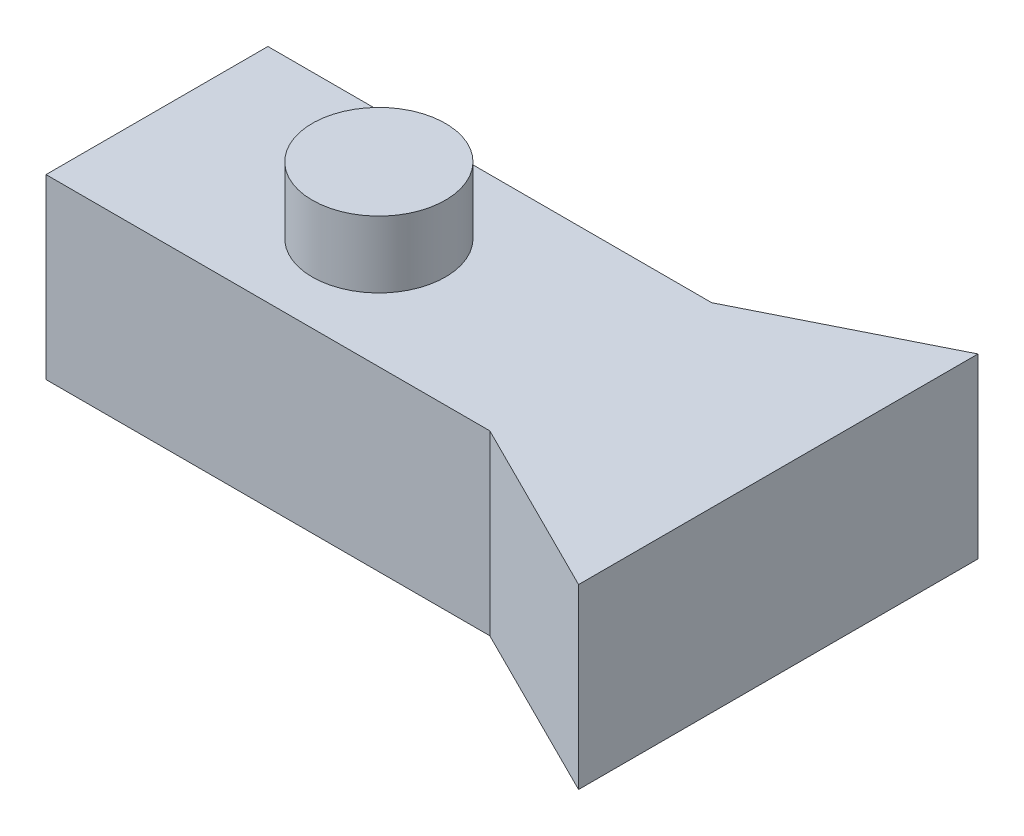
ISO-10303-21;
HEADER;
FILE_DESCRIPTION(('STEP AP214'),'2;1');
FILE_NAME('part.step','',(''),(''),'','','');
FILE_SCHEMA(('AUTOMOTIVE_DESIGN { 1 0 10303 214 1 1 1 1 }'));
ENDSEC;
DATA;
#1=APPLICATION_CONTEXT('core data for automotive mechanical design processes');
#2=APPLICATION_PROTOCOL_DEFINITION('international standard','automotive_design',2000,#1);
#3=PRODUCT_CONTEXT('',#1,'mechanical');
#4=PRODUCT('Part','Part','',(#3));
#5=PRODUCT_RELATED_PRODUCT_CATEGORY('part','',(#4));
#6=PRODUCT_DEFINITION_FORMATION('','',#4);
#7=PRODUCT_DEFINITION_CONTEXT('part definition',#1,'design');
#8=PRODUCT_DEFINITION('design','',#6,#7);
#9=PRODUCT_DEFINITION_SHAPE('','',#8);
#10=(LENGTH_UNIT() NAMED_UNIT(*) SI_UNIT(.MILLI.,.METRE.));
#11=(NAMED_UNIT(*) PLANE_ANGLE_UNIT() SI_UNIT($,.RADIAN.));
#12=(NAMED_UNIT(*) SI_UNIT($,.STERADIAN.) SOLID_ANGLE_UNIT());
#13=UNCERTAINTY_MEASURE_WITH_UNIT(LENGTH_MEASURE(1.E-05),#10,'distance_accuracy_value','');
#14=(GEOMETRIC_REPRESENTATION_CONTEXT(3) GLOBAL_UNCERTAINTY_ASSIGNED_CONTEXT((#13)) GLOBAL_UNIT_ASSIGNED_CONTEXT((#10,
#11,#12)) REPRESENTATION_CONTEXT('',''));
#15=CARTESIAN_POINT('',(0.,0.,0.));
#16=DIRECTION('',(0.,0.,1.));
#17=DIRECTION('',(1.,0.,0.));
#18=AXIS2_PLACEMENT_3D('',#15,#16,#17);
#19=CARTESIAN_POINT('',(200.,400.,-400.));
#20=DIRECTION('',(-0.447213595499958,0.,0.894427190999916));
#21=DIRECTION('',(0.894427190999916,0.,0.447213595499958));
#22=AXIS2_PLACEMENT_3D('',#19,#20,#21);
#23=PLANE('',#22);
#24=DIRECTION('',(-0.894427190999916,0.,-0.447213595499958));
#25=VECTOR('',#24,1.);
#26=CARTESIAN_POINT('',(200.,0.,-400.));
#27=LINE('',#26,#25);
#28=CARTESIAN_POINT('',(1400.,0.,200.));
#29=VERTEX_POINT('',#28);
#30=CARTESIAN_POINT('',(1000.,0.,0.));
#31=VERTEX_POINT('',#30);
#32=EDGE_CURVE('E116',#29,#31,#27,.T.);
#33=ORIENTED_EDGE('',*,*,#32,.F.);
#34=DIRECTION('',(0.,-1.,0.));
#35=VECTOR('',#34,1.);
#36=CARTESIAN_POINT('',(1400.,400.,200.));
#37=LINE('',#36,#35);
#38=CARTESIAN_POINT('',(1400.,400.,200.));
#39=VERTEX_POINT('',#38);
#40=EDGE_CURVE('E11',#39,#29,#37,.T.);
#41=ORIENTED_EDGE('',*,*,#40,.F.);
#42=DIRECTION('',(-0.894427190999916,0.,-0.447213595499958));
#43=VECTOR('',#42,1.);
#44=CARTESIAN_POINT('',(200.,400.,-400.));
#45=LINE('',#44,#43);
#46=CARTESIAN_POINT('',(1000.,400.,0.));
#47=VERTEX_POINT('',#46);
#48=EDGE_CURVE('E131',#39,#47,#45,.T.);
#49=ORIENTED_EDGE('',*,*,#48,.T.);
#50=DIRECTION('',(0.,-1.,0.));
#51=VECTOR('',#50,1.);
#52=CARTESIAN_POINT('',(1000.,400.,0.));
#53=LINE('',#52,#51);
#54=EDGE_CURVE('E79',#47,#31,#53,.T.);
#55=ORIENTED_EDGE('',*,*,#54,.T.);
#56=EDGE_LOOP('',(#33,#41,#49,#55));
#57=FACE_BOUND('',#56,.T.);
#58=ADVANCED_FACE('F35',(#57),#23,.T.);
#59=CARTESIAN_POINT('',(1400.,400.,0.));
#60=DIRECTION('',(1.,0.,0.));
#61=DIRECTION('',(0.,0.,-1.));
#62=AXIS2_PLACEMENT_3D('',#59,#60,#61);
#63=PLANE('',#62);
#64=DIRECTION('',(0.,0.,1.));
#65=VECTOR('',#64,1.);
#66=CARTESIAN_POINT('',(1400.,0.,0.));
#67=LINE('',#66,#65);
#68=CARTESIAN_POINT('',(1400.,0.,-700.));
#69=VERTEX_POINT('',#68);
#70=EDGE_CURVE('E119',#69,#29,#67,.T.);
#71=ORIENTED_EDGE('',*,*,#70,.F.);
#72=DIRECTION('',(0.,-1.,0.));
#73=VECTOR('',#72,1.);
#74=CARTESIAN_POINT('',(1400.,400.,-700.));
#75=LINE('',#74,#73);
#76=CARTESIAN_POINT('',(1400.,400.,-700.));
#77=VERTEX_POINT('',#76);
#78=EDGE_CURVE('E43',#77,#69,#75,.T.);
#79=ORIENTED_EDGE('',*,*,#78,.F.);
#80=DIRECTION('',(0.,0.,1.));
#81=VECTOR('',#80,1.);
#82=CARTESIAN_POINT('',(1400.,400.,0.));
#83=LINE('',#82,#81);
#84=EDGE_CURVE('E144',#77,#39,#83,.T.);
#85=ORIENTED_EDGE('',*,*,#84,.T.);
#86=ORIENTED_EDGE('',*,*,#40,.T.);
#87=EDGE_LOOP('',(#71,#79,#85,#86));
#88=FACE_BOUND('',#87,.T.);
#89=ADVANCED_FACE('F140',(#88),#63,.T.);
#90=CARTESIAN_POINT('',(0.,400.,0.));
#91=DIRECTION('',(-0.447213595499958,0.,-0.894427190999916));
#92=DIRECTION('',(-0.894427190999916,0.,0.447213595499958));
#93=AXIS2_PLACEMENT_3D('',#90,#91,#92);
#94=PLANE('',#93);
#95=DIRECTION('',(0.894427190999916,0.,-0.447213595499958));
#96=VECTOR('',#95,1.);
#97=CARTESIAN_POINT('',(0.,0.,0.));
#98=LINE('',#97,#96);
#99=CARTESIAN_POINT('',(1000.,0.,-500.));
#100=VERTEX_POINT('',#99);
#101=EDGE_CURVE('E123',#100,#69,#98,.T.);
#102=ORIENTED_EDGE('',*,*,#101,.F.);
#103=DIRECTION('',(0.,-1.,0.));
#104=VECTOR('',#103,1.);
#105=CARTESIAN_POINT('',(1000.,400.,-500.));
#106=LINE('',#105,#104);
#107=CARTESIAN_POINT('',(1000.,400.,-500.));
#108=VERTEX_POINT('',#107);
#109=EDGE_CURVE('E102',#108,#100,#106,.T.);
#110=ORIENTED_EDGE('',*,*,#109,.F.);
#111=DIRECTION('',(0.894427190999916,0.,-0.447213595499958));
#112=VECTOR('',#111,1.);
#113=CARTESIAN_POINT('',(0.,400.,0.));
#114=LINE('',#113,#112);
#115=EDGE_CURVE('E109',#108,#77,#114,.T.);
#116=ORIENTED_EDGE('',*,*,#115,.T.);
#117=ORIENTED_EDGE('',*,*,#78,.T.);
#118=EDGE_LOOP('',(#102,#110,#116,#117));
#119=FACE_BOUND('',#118,.T.);
#120=ADVANCED_FACE('F137',(#119),#94,.T.);
#121=CARTESIAN_POINT('',(0.,400.,-500.));
#122=DIRECTION('',(0.,0.,-1.));
#123=DIRECTION('',(-1.,0.,0.));
#124=AXIS2_PLACEMENT_3D('',#121,#122,#123);
#125=PLANE('',#124);
#126=DIRECTION('',(1.,0.,0.));
#127=VECTOR('',#126,1.);
#128=CARTESIAN_POINT('',(0.,0.,-500.));
#129=LINE('',#128,#127);
#130=CARTESIAN_POINT('',(0.,0.,-500.));
#131=VERTEX_POINT('',#130);
#132=EDGE_CURVE('E97',#131,#100,#129,.T.);
#133=ORIENTED_EDGE('',*,*,#132,.F.);
#134=DIRECTION('',(0.,-1.,0.));
#135=VECTOR('',#134,1.);
#136=CARTESIAN_POINT('',(0.,400.,-500.));
#137=LINE('',#136,#135);
#138=CARTESIAN_POINT('',(0.,400.,-500.));
#139=VERTEX_POINT('',#138);
#140=EDGE_CURVE('E92',#139,#131,#137,.T.);
#141=ORIENTED_EDGE('',*,*,#140,.F.);
#142=DIRECTION('',(1.,0.,0.));
#143=VECTOR('',#142,1.);
#144=CARTESIAN_POINT('',(0.,400.,-500.));
#145=LINE('',#144,#143);
#146=EDGE_CURVE('E95',#139,#108,#145,.T.);
#147=ORIENTED_EDGE('',*,*,#146,.T.);
#148=ORIENTED_EDGE('',*,*,#109,.T.);
#149=EDGE_LOOP('',(#133,#141,#147,#148));
#150=FACE_BOUND('',#149,.T.);
#151=ADVANCED_FACE('F94',(#150),#125,.T.);
#152=CARTESIAN_POINT('',(0.,400.,0.));
#153=DIRECTION('',(-1.,0.,0.));
#154=DIRECTION('',(0.,0.,1.));
#155=AXIS2_PLACEMENT_3D('',#152,#153,#154);
#156=PLANE('',#155);
#157=DIRECTION('',(0.,0.,-1.));
#158=VECTOR('',#157,1.);
#159=CARTESIAN_POINT('',(0.,0.,0.));
#160=LINE('',#159,#158);
#161=CARTESIAN_POINT('',(0.,0.,0.));
#162=VERTEX_POINT('',#161);
#163=EDGE_CURVE('E127',#162,#131,#160,.T.);
#164=ORIENTED_EDGE('',*,*,#163,.F.);
#165=DIRECTION('',(0.,-1.,0.));
#166=VECTOR('',#165,1.);
#167=CARTESIAN_POINT('',(0.,400.,0.));
#168=LINE('',#167,#166);
#169=CARTESIAN_POINT('',(0.,400.,0.));
#170=VERTEX_POINT('',#169);
#171=EDGE_CURVE('E72',#170,#162,#168,.T.);
#172=ORIENTED_EDGE('',*,*,#171,.F.);
#173=DIRECTION('',(0.,0.,-1.));
#174=VECTOR('',#173,1.);
#175=CARTESIAN_POINT('',(0.,400.,0.));
#176=LINE('',#175,#174);
#177=EDGE_CURVE('E106',#170,#139,#176,.T.);
#178=ORIENTED_EDGE('',*,*,#177,.T.);
#179=ORIENTED_EDGE('',*,*,#140,.T.);
#180=EDGE_LOOP('',(#164,#172,#178,#179));
#181=FACE_BOUND('',#180,.T.);
#182=ADVANCED_FACE('F111',(#181),#156,.T.);
#183=CARTESIAN_POINT('',(0.,400.,0.));
#184=DIRECTION('',(0.,0.,-1.));
#185=DIRECTION('',(-1.,0.,0.));
#186=AXIS2_PLACEMENT_3D('',#183,#184,#185);
#187=PLANE('',#186);
#188=DIRECTION('',(1.,0.,0.));
#189=VECTOR('',#188,1.);
#190=CARTESIAN_POINT('',(0.,0.,0.));
#191=LINE('',#190,#189);
#192=EDGE_CURVE('E129',#162,#31,#191,.T.);
#193=ORIENTED_EDGE('',*,*,#192,.T.);
#194=ORIENTED_EDGE('',*,*,#54,.F.);
#195=DIRECTION('',(1.,0.,0.));
#196=VECTOR('',#195,1.);
#197=CARTESIAN_POINT('',(0.,400.,0.));
#198=LINE('',#197,#196);
#199=EDGE_CURVE('E51',#170,#47,#198,.T.);
#200=ORIENTED_EDGE('',*,*,#199,.F.);
#201=ORIENTED_EDGE('',*,*,#171,.T.);
#202=EDGE_LOOP('',(#193,#194,#200,#201));
#203=FACE_BOUND('',#202,.T.);
#204=ADVANCED_FACE('F143',(#203),#187,.F.);
#205=CARTESIAN_POINT('',(0.,400.,0.));
#206=DIRECTION('',(0.,1.,0.));
#207=DIRECTION('',(0.,0.,1.));
#208=AXIS2_PLACEMENT_3D('',#205,#206,#207);
#209=PLANE('',#208);
#210=CARTESIAN_POINT('',(500.,400.,-250.));
#211=DIRECTION('',(0.,1.,0.));
#212=DIRECTION('',(0.,0.,1.));
#213=AXIS2_PLACEMENT_3D('',#210,#211,#212);
#214=CIRCLE('',#213,150.);
#215=CARTESIAN_POINT('',(500.,400.,-99.9999999999999));
#216=VERTEX_POINT('',#215);
#217=EDGE_CURVE('E148',#216,#216,#214,.T.);
#218=ORIENTED_EDGE('',*,*,#217,.F.);
#219=EDGE_LOOP('',(#218));
#220=FACE_BOUND('',#219,.T.);
#221=ORIENTED_EDGE('',*,*,#48,.F.);
#222=ORIENTED_EDGE('',*,*,#84,.F.);
#223=ORIENTED_EDGE('',*,*,#115,.F.);
#224=ORIENTED_EDGE('',*,*,#146,.F.);
#225=ORIENTED_EDGE('',*,*,#177,.F.);
#226=ORIENTED_EDGE('',*,*,#199,.T.);
#227=EDGE_LOOP('',(#221,#222,#223,#224,#225,#226));
#228=FACE_BOUND('',#227,.T.);
#229=ADVANCED_FACE('F105',(#220,#228),#209,.T.);
#230=CARTESIAN_POINT('',(0.,0.,0.));
#231=DIRECTION('',(0.,1.,0.));
#232=DIRECTION('',(0.,0.,1.));
#233=AXIS2_PLACEMENT_3D('',#230,#231,#232);
#234=PLANE('',#233);
#235=ORIENTED_EDGE('',*,*,#32,.T.);
#236=ORIENTED_EDGE('',*,*,#192,.F.);
#237=ORIENTED_EDGE('',*,*,#163,.T.);
#238=ORIENTED_EDGE('',*,*,#132,.T.);
#239=ORIENTED_EDGE('',*,*,#101,.T.);
#240=ORIENTED_EDGE('',*,*,#70,.T.);
#241=EDGE_LOOP('',(#235,#236,#237,#238,#239,#240));
#242=FACE_BOUND('',#241,.T.);
#243=ADVANCED_FACE('F142',(#242),#234,.F.);
#244=CARTESIAN_POINT('',(500.,550.,-250.));
#245=DIRECTION('',(0.,-1.,0.));
#246=DIRECTION('',(0.,0.,-1.));
#247=AXIS2_PLACEMENT_3D('',#244,#245,#246);
#248=CYLINDRICAL_SURFACE('',#247,150.);
#249=CARTESIAN_POINT('',(500.,550.,-250.));
#250=DIRECTION('',(0.,1.,0.));
#251=DIRECTION('',(0.,0.,1.));
#252=AXIS2_PLACEMENT_3D('',#249,#250,#251);
#253=CIRCLE('',#252,150.);
#254=CARTESIAN_POINT('',(500.,550.,-99.9999999999999));
#255=VERTEX_POINT('',#254);
#256=EDGE_CURVE('E120',#255,#255,#253,.T.);
#257=ORIENTED_EDGE('',*,*,#256,.F.);
#258=EDGE_LOOP('',(#257));
#259=FACE_BOUND('',#258,.T.);
#260=ORIENTED_EDGE('',*,*,#217,.T.);
#261=EDGE_LOOP('',(#260));
#262=FACE_BOUND('',#261,.T.);
#263=ADVANCED_FACE('F156',(#259,#262),#248,.T.);
#264=CARTESIAN_POINT('',(500.,550.,-250.));
#265=DIRECTION('',(0.,1.,0.));
#266=DIRECTION('',(0.,0.,1.));
#267=AXIS2_PLACEMENT_3D('',#264,#265,#266);
#268=PLANE('',#267);
#269=ORIENTED_EDGE('',*,*,#256,.T.);
#270=EDGE_LOOP('',(#269));
#271=FACE_BOUND('',#270,.T.);
#272=ADVANCED_FACE('F154',(#271),#268,.T.);
#273=CLOSED_SHELL('',(#58,#89,#120,#151,#182,#204,#229,#243,#263,#272));
#274=MANIFOLD_SOLID_BREP('B2',#273);
#275=ADVANCED_BREP_SHAPE_REPRESENTATION('',(#18,#274),#14);
#276=SHAPE_DEFINITION_REPRESENTATION(#9,#275);
ENDSEC;
END-ISO-10303-21;
